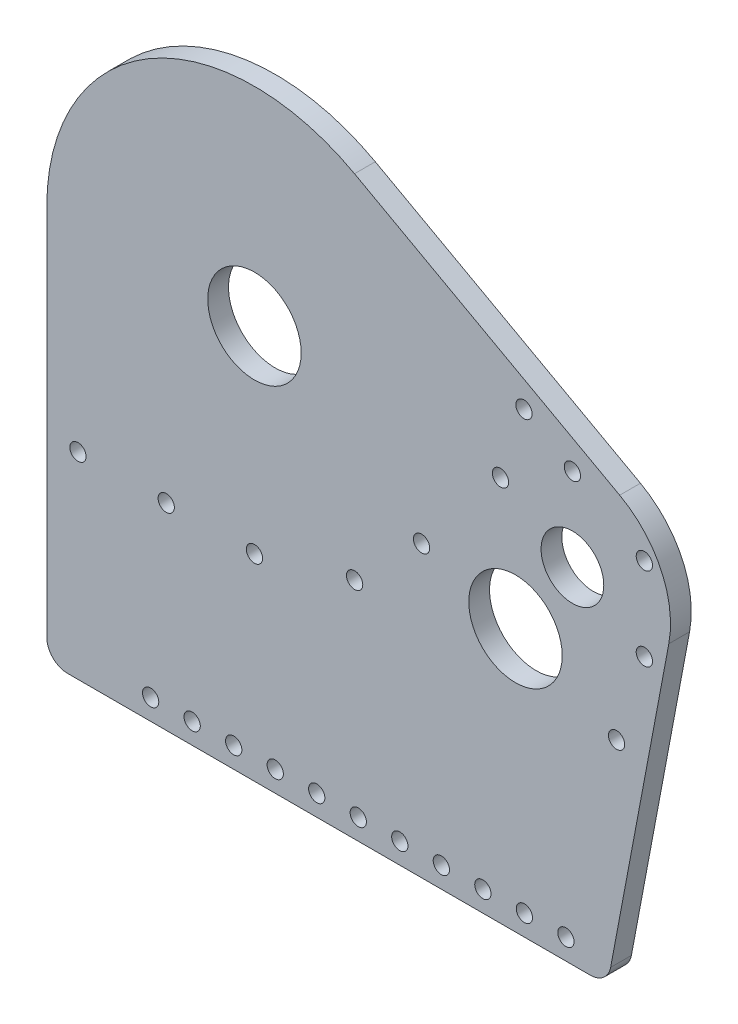
ISO-10303-21;
HEADER;
FILE_DESCRIPTION(('STEP AP214'),'2;1');
FILE_NAME('part.step','',(''),(''),'','','');
FILE_SCHEMA(('AUTOMOTIVE_DESIGN { 1 0 10303 214 1 1 1 1 }'));
ENDSEC;
DATA;
#1=APPLICATION_CONTEXT('core data for automotive mechanical design processes');
#2=APPLICATION_PROTOCOL_DEFINITION('international standard','automotive_design',2000,#1);
#3=PRODUCT_CONTEXT('',#1,'mechanical');
#4=PRODUCT('Part','Part','',(#3));
#5=PRODUCT_RELATED_PRODUCT_CATEGORY('part','',(#4));
#6=PRODUCT_DEFINITION_FORMATION('','',#4);
#7=PRODUCT_DEFINITION_CONTEXT('part definition',#1,'design');
#8=PRODUCT_DEFINITION('design','',#6,#7);
#9=PRODUCT_DEFINITION_SHAPE('','',#8);
#10=(LENGTH_UNIT() NAMED_UNIT(*) SI_UNIT(.MILLI.,.METRE.));
#11=(NAMED_UNIT(*) PLANE_ANGLE_UNIT() SI_UNIT($,.RADIAN.));
#12=(NAMED_UNIT(*) SI_UNIT($,.STERADIAN.) SOLID_ANGLE_UNIT());
#13=UNCERTAINTY_MEASURE_WITH_UNIT(LENGTH_MEASURE(1.E-05),#10,'distance_accuracy_value','');
#14=(GEOMETRIC_REPRESENTATION_CONTEXT(3) GLOBAL_UNCERTAINTY_ASSIGNED_CONTEXT((#13)) GLOBAL_UNIT_ASSIGNED_CONTEXT((#10,
#11,#12)) REPRESENTATION_CONTEXT('',''));
#15=CARTESIAN_POINT('',(0.,0.,0.));
#16=DIRECTION('',(0.,0.,1.));
#17=DIRECTION('',(1.,0.,0.));
#18=AXIS2_PLACEMENT_3D('',#15,#16,#17);
#19=CARTESIAN_POINT('',(88.9,154.686,-6.35));
#20=DIRECTION('',(-1.,0.,0.));
#21=DIRECTION('',(0.,-1.,0.));
#22=AXIS2_PLACEMENT_3D('',#19,#20,#21);
#23=PLANE('',#22);
#24=DIRECTION('',(0.,-1.,0.));
#25=VECTOR('',#24,1.);
#26=CARTESIAN_POINT('',(88.9,100.1522,-6.35));
#27=LINE('',#26,#25);
#28=CARTESIAN_POINT('',(88.8999999999999,220.726,-6.35));
#29=VERTEX_POINT('',#28);
#30=CARTESIAN_POINT('',(88.9,106.5022,-6.35));
#31=VERTEX_POINT('',#30);
#32=EDGE_CURVE('E167',#29,#31,#27,.T.);
#33=ORIENTED_EDGE('',*,*,#32,.T.);
#34=DIRECTION('',(0.,0.,1.));
#35=VECTOR('',#34,1.);
#36=CARTESIAN_POINT('',(88.9,106.5022,-6.35));
#37=LINE('',#36,#35);
#38=CARTESIAN_POINT('',(88.9,106.5022,0.));
#39=VERTEX_POINT('',#38);
#40=EDGE_CURVE('E11',#31,#39,#37,.T.);
#41=ORIENTED_EDGE('',*,*,#40,.T.);
#42=DIRECTION('',(0.,-1.,0.));
#43=VECTOR('',#42,1.);
#44=CARTESIAN_POINT('',(88.9,154.686,0.));
#45=LINE('',#44,#43);
#46=CARTESIAN_POINT('',(88.8999999999999,220.726,0.));
#47=VERTEX_POINT('',#46);
#48=EDGE_CURVE('E163',#47,#39,#45,.T.);
#49=ORIENTED_EDGE('',*,*,#48,.F.);
#50=DIRECTION('',(0.,0.,1.));
#51=VECTOR('',#50,1.);
#52=CARTESIAN_POINT('',(88.8999999999999,220.726,-6.35));
#53=LINE('',#52,#51);
#54=EDGE_CURVE('E168',#29,#47,#53,.T.);
#55=ORIENTED_EDGE('',*,*,#54,.F.);
#56=EDGE_LOOP('',(#33,#41,#49,#55));
#57=FACE_BOUND('',#56,.T.);
#58=ADVANCED_FACE('F45',(#57),#23,.T.);
#59=CARTESIAN_POINT('',(152.4,220.726,-6.35));
#60=DIRECTION('',(0.,0.,1.));
#61=DIRECTION('',(1.,0.,0.));
#62=AXIS2_PLACEMENT_3D('',#59,#60,#61);
#63=CYLINDRICAL_SURFACE('',#62,63.5);
#64=CARTESIAN_POINT('',(152.4,220.726,0.));
#65=DIRECTION('',(0.,0.,1.));
#66=DIRECTION('',(1.,0.,0.));
#67=AXIS2_PLACEMENT_3D('',#64,#65,#66);
#68=CIRCLE('',#67,63.5);
#69=CARTESIAN_POINT('',(182.999185553991,276.367170399556,0.));
#70=VERTEX_POINT('',#69);
#71=EDGE_CURVE('E159',#70,#47,#68,.T.);
#72=ORIENTED_EDGE('',*,*,#71,.F.);
#73=DIRECTION('',(0.,0.,1.));
#74=VECTOR('',#73,1.);
#75=CARTESIAN_POINT('',(182.999185553991,276.367170399556,-6.35));
#76=LINE('',#75,#74);
#77=CARTESIAN_POINT('',(182.999185553991,276.367170399556,-6.35));
#78=VERTEX_POINT('',#77);
#79=EDGE_CURVE('E172',#78,#70,#76,.T.);
#80=ORIENTED_EDGE('',*,*,#79,.F.);
#81=CARTESIAN_POINT('',(152.4,220.726,-6.35));
#82=DIRECTION('',(0.,0.,1.));
#83=DIRECTION('',(1.,0.,0.));
#84=AXIS2_PLACEMENT_3D('',#81,#82,#83);
#85=CIRCLE('',#84,63.5);
#86=EDGE_CURVE('E129',#78,#29,#85,.T.);
#87=ORIENTED_EDGE('',*,*,#86,.T.);
#88=ORIENTED_EDGE('',*,*,#54,.T.);
#89=EDGE_LOOP('',(#72,#80,#87,#88));
#90=FACE_BOUND('',#89,.T.);
#91=ADVANCED_FACE('F212',(#90),#63,.T.);
#92=CARTESIAN_POINT('',(182.999185553991,276.367170399556,-6.35));
#93=DIRECTION('',(0.481876937858131,0.876238903930013,0.));
#94=DIRECTION('',(-0.876238903930013,0.481876937858132,0.));
#95=AXIS2_PLACEMENT_3D('',#92,#93,#94);
#96=PLANE('',#95);
#97=DIRECTION('',(-0.876238903930013,0.481876937858131,0.));
#98=VECTOR('',#97,1.);
#99=CARTESIAN_POINT('',(182.999185553991,276.367170399556,0.));
#100=LINE('',#99,#98);
#101=CARTESIAN_POINT('',(264.092497462763,231.77088889675,0.));
#102=VERTEX_POINT('',#101);
#103=EDGE_CURVE('E155',#102,#70,#100,.T.);
#104=ORIENTED_EDGE('',*,*,#103,.F.);
#105=DIRECTION('',(0.,0.,1.));
#106=VECTOR('',#105,1.);
#107=CARTESIAN_POINT('',(264.092497462763,231.77088889675,-6.35));
#108=LINE('',#107,#106);
#109=CARTESIAN_POINT('',(264.092497462763,231.77088889675,-6.35));
#110=VERTEX_POINT('',#109);
#111=EDGE_CURVE('E128',#110,#102,#108,.T.);
#112=ORIENTED_EDGE('',*,*,#111,.F.);
#113=DIRECTION('',(-0.876238903930013,0.481876937858131,0.));
#114=VECTOR('',#113,1.);
#115=CARTESIAN_POINT('',(182.999185553991,276.367170399556,-6.35));
#116=LINE('',#115,#114);
#117=EDGE_CURVE('E135',#110,#78,#116,.T.);
#118=ORIENTED_EDGE('',*,*,#117,.T.);
#119=ORIENTED_EDGE('',*,*,#79,.T.);
#120=EDGE_LOOP('',(#104,#112,#118,#119));
#121=FACE_BOUND('',#120,.T.);
#122=ADVANCED_FACE('F214',(#121),#96,.T.);
#123=CARTESIAN_POINT('',(249.637442207057,205.486,-6.35));
#124=DIRECTION('',(0.,0.,1.));
#125=DIRECTION('',(1.,0.,0.));
#126=AXIS2_PLACEMENT_3D('',#123,#124,#125);
#127=CYLINDRICAL_SURFACE('',#126,29.9973999999996);
#128=CARTESIAN_POINT('',(249.637442207057,205.486,0.));
#129=DIRECTION('',(0.,0.,1.));
#130=DIRECTION('',(1.,0.,0.));
#131=AXIS2_PLACEMENT_3D('',#128,#129,#130);
#132=CIRCLE('',#131,29.9973999999996);
#133=CARTESIAN_POINT('',(279.11797123012,199.941415680115,0.));
#134=VERTEX_POINT('',#133);
#135=EDGE_CURVE('E126',#134,#102,#132,.T.);
#136=ORIENTED_EDGE('',*,*,#135,.F.);
#137=DIRECTION('',(0.,0.,1.));
#138=VECTOR('',#137,1.);
#139=CARTESIAN_POINT('',(279.11797123012,199.941415680115,-6.35));
#140=LINE('',#139,#138);
#141=CARTESIAN_POINT('',(279.11797123012,199.941415680115,-6.35));
#142=VERTEX_POINT('',#141);
#143=EDGE_CURVE('E114',#142,#134,#140,.T.);
#144=ORIENTED_EDGE('',*,*,#143,.F.);
#145=CARTESIAN_POINT('',(249.637442207057,205.486,-6.35));
#146=DIRECTION('',(0.,0.,1.));
#147=DIRECTION('',(1.,0.,0.));
#148=AXIS2_PLACEMENT_3D('',#145,#146,#147);
#149=CIRCLE('',#148,29.9973999999996);
#150=EDGE_CURVE('E119',#142,#110,#149,.T.);
#151=ORIENTED_EDGE('',*,*,#150,.T.);
#152=ORIENTED_EDGE('',*,*,#111,.T.);
#153=EDGE_LOOP('',(#136,#144,#151,#152));
#154=FACE_BOUND('',#153,.T.);
#155=ADVANCED_FACE('F124',(#154),#127,.T.);
#156=CARTESIAN_POINT('',(260.35,100.1522,-6.35));
#157=DIRECTION('',(0.982769474123205,-0.184835496405853,0.));
#158=DIRECTION('',(0.184835496405853,0.982769474123206,0.));
#159=AXIS2_PLACEMENT_3D('',#156,#157,#158);
#160=PLANE('',#159);
#161=DIRECTION('',(0.184835496405853,0.982769474123206,0.));
#162=VECTOR('',#161,1.);
#163=CARTESIAN_POINT('',(260.35,100.1522,0.));
#164=LINE('',#163,#162);
#165=CARTESIAN_POINT('',(261.3235375454,105.328494597823,0.));
#166=VERTEX_POINT('',#165);
#167=EDGE_CURVE('E149',#166,#134,#164,.T.);
#168=ORIENTED_EDGE('',*,*,#167,.F.);
#169=DIRECTION('',(0.,0.,1.));
#170=VECTOR('',#169,1.);
#171=CARTESIAN_POINT('',(261.3235375454,105.328494597823,-6.35));
#172=LINE('',#171,#170);
#173=CARTESIAN_POINT('',(261.3235375454,105.328494597823,-6.35));
#174=VERTEX_POINT('',#173);
#175=EDGE_CURVE('E69',#166,#174,#172,.F.);
#176=ORIENTED_EDGE('',*,*,#175,.T.);
#177=DIRECTION('',(0.184835496405853,0.982769474123206,0.));
#178=VECTOR('',#177,1.);
#179=CARTESIAN_POINT('',(260.35,100.1522,-6.35));
#180=LINE('',#179,#178);
#181=EDGE_CURVE('E111',#174,#142,#180,.T.);
#182=ORIENTED_EDGE('',*,*,#181,.T.);
#183=ORIENTED_EDGE('',*,*,#143,.T.);
#184=EDGE_LOOP('',(#168,#176,#182,#183));
#185=FACE_BOUND('',#184,.T.);
#186=ADVANCED_FACE('F113',(#185),#160,.T.);
#187=CARTESIAN_POINT('',(88.9,100.1522,-6.35));
#188=DIRECTION('',(0.,-1.,0.));
#189=DIRECTION('',(0.,0.,-1.));
#190=AXIS2_PLACEMENT_3D('',#187,#188,#189);
#191=PLANE('',#190);
#192=DIRECTION('',(1.,0.,0.));
#193=VECTOR('',#192,1.);
#194=CARTESIAN_POINT('',(88.9,100.1522,-6.35));
#195=LINE('',#194,#193);
#196=CARTESIAN_POINT('',(95.25,100.1522,-6.35));
#197=VERTEX_POINT('',#196);
#198=CARTESIAN_POINT('',(255.082951384717,100.1522,-6.35));
#199=VERTEX_POINT('',#198);
#200=EDGE_CURVE('E120',#197,#199,#195,.T.);
#201=ORIENTED_EDGE('',*,*,#200,.T.);
#202=DIRECTION('',(0.,0.,1.));
#203=VECTOR('',#202,1.);
#204=CARTESIAN_POINT('',(255.082951384717,100.1522,-6.35));
#205=LINE('',#204,#203);
#206=CARTESIAN_POINT('',(255.082951384717,100.1522,0.));
#207=VERTEX_POINT('',#206);
#208=EDGE_CURVE('E179',#199,#207,#205,.T.);
#209=ORIENTED_EDGE('',*,*,#208,.T.);
#210=DIRECTION('',(1.,0.,0.));
#211=VECTOR('',#210,1.);
#212=CARTESIAN_POINT('',(88.9,100.1522,0.));
#213=LINE('',#212,#211);
#214=CARTESIAN_POINT('',(95.25,100.1522,0.));
#215=VERTEX_POINT('',#214);
#216=EDGE_CURVE('E145',#215,#207,#213,.T.);
#217=ORIENTED_EDGE('',*,*,#216,.F.);
#218=DIRECTION('',(0.,0.,1.));
#219=VECTOR('',#218,1.);
#220=CARTESIAN_POINT('',(95.25,100.1522,-6.35));
#221=LINE('',#220,#219);
#222=EDGE_CURVE('E171',#215,#197,#221,.F.);
#223=ORIENTED_EDGE('',*,*,#222,.T.);
#224=EDGE_LOOP('',(#201,#209,#217,#223));
#225=FACE_BOUND('',#224,.T.);
#226=ADVANCED_FACE('F197',(#225),#191,.T.);
#227=CARTESIAN_POINT('',(152.4,220.726,-6.35));
#228=DIRECTION('',(0.,0.,1.));
#229=DIRECTION('',(1.,0.,0.));
#230=AXIS2_PLACEMENT_3D('',#227,#228,#229);
#231=PLANE('',#230);
#232=CARTESIAN_POINT('',(203.511307769551,188.683218549473,-6.35));
#233=DIRECTION('',(0.,0.,1.));
#234=DIRECTION('',(1.,0.,0.));
#235=AXIS2_PLACEMENT_3D('',#232,#233,#234);
#236=CIRCLE('',#235,2.48920000000001);
#237=CARTESIAN_POINT('',(206.000507769551,188.683218549473,-6.35));
#238=VERTEX_POINT('',#237);
#239=EDGE_CURVE('E442',#238,#238,#236,.T.);
#240=ORIENTED_EDGE('',*,*,#239,.T.);
#241=EDGE_LOOP('',(#240));
#242=FACE_BOUND('',#241,.T.);
#243=CARTESIAN_POINT('',(183.030900697863,168.756263157895,-6.35));
#244=DIRECTION('',(0.,0.,1.));
#245=DIRECTION('',(1.,0.,0.));
#246=AXIS2_PLACEMENT_3D('',#243,#244,#245);
#247=CIRCLE('',#246,2.48920000000001);
#248=CARTESIAN_POINT('',(185.520100697863,168.756263157895,-6.35));
#249=VERTEX_POINT('',#248);
#250=EDGE_CURVE('E450',#249,#249,#247,.T.);
#251=ORIENTED_EDGE('',*,*,#250,.T.);
#252=EDGE_LOOP('',(#251));
#253=FACE_BOUND('',#252,.T.);
#254=CARTESIAN_POINT('',(152.4,160.401,-6.35));
#255=DIRECTION('',(0.,0.,1.));
#256=DIRECTION('',(1.,0.,0.));
#257=AXIS2_PLACEMENT_3D('',#254,#255,#256);
#258=CIRCLE('',#257,2.48920000000001);
#259=CARTESIAN_POINT('',(154.8892,160.401,-6.35));
#260=VERTEX_POINT('',#259);
#261=EDGE_CURVE('E458',#260,#260,#258,.T.);
#262=ORIENTED_EDGE('',*,*,#261,.T.);
#263=EDGE_LOOP('',(#262));
#264=FACE_BOUND('',#263,.T.);
#265=CARTESIAN_POINT('',(247.65,106.5022,-6.35));
#266=DIRECTION('',(0.,0.,1.));
#267=DIRECTION('',(1.,0.,0.));
#268=AXIS2_PLACEMENT_3D('',#265,#266,#267);
#269=CIRCLE('',#268,2.48919999999998);
#270=CARTESIAN_POINT('',(250.1392,106.5022,-6.35));
#271=VERTEX_POINT('',#270);
#272=EDGE_CURVE('E413',#271,#271,#269,.T.);
#273=ORIENTED_EDGE('',*,*,#272,.T.);
#274=EDGE_LOOP('',(#273));
#275=FACE_BOUND('',#274,.T.);
#276=CARTESIAN_POINT('',(234.95,106.5022,-6.35));
#277=DIRECTION('',(0.,0.,1.));
#278=DIRECTION('',(1.,0.,0.));
#279=AXIS2_PLACEMENT_3D('',#276,#277,#278);
#280=CIRCLE('',#279,2.4892);
#281=CARTESIAN_POINT('',(237.4392,106.5022,-6.35));
#282=VERTEX_POINT('',#281);
#283=EDGE_CURVE('E414',#282,#282,#280,.T.);
#284=ORIENTED_EDGE('',*,*,#283,.T.);
#285=EDGE_LOOP('',(#284));
#286=FACE_BOUND('',#285,.T.);
#287=CARTESIAN_POINT('',(222.25,106.5022,-6.35));
#288=DIRECTION('',(0.,0.,1.));
#289=DIRECTION('',(1.,0.,0.));
#290=AXIS2_PLACEMENT_3D('',#287,#288,#289);
#291=CIRCLE('',#290,2.4892);
#292=CARTESIAN_POINT('',(224.7392,106.5022,-6.35));
#293=VERTEX_POINT('',#292);
#294=EDGE_CURVE('E422',#293,#293,#291,.T.);
#295=ORIENTED_EDGE('',*,*,#294,.T.);
#296=EDGE_LOOP('',(#295));
#297=FACE_BOUND('',#296,.T.);
#298=CARTESIAN_POINT('',(209.55,106.5022,-6.35));
#299=DIRECTION('',(0.,0.,1.));
#300=DIRECTION('',(1.,0.,0.));
#301=AXIS2_PLACEMENT_3D('',#298,#299,#300);
#302=CIRCLE('',#301,2.4892);
#303=CARTESIAN_POINT('',(212.0392,106.5022,-6.35));
#304=VERTEX_POINT('',#303);
#305=EDGE_CURVE('E430',#304,#304,#302,.T.);
#306=ORIENTED_EDGE('',*,*,#305,.T.);
#307=EDGE_LOOP('',(#306));
#308=FACE_BOUND('',#307,.T.);
#309=CARTESIAN_POINT('',(196.85,106.5022,-6.35));
#310=DIRECTION('',(0.,0.,1.));
#311=DIRECTION('',(1.,0.,0.));
#312=AXIS2_PLACEMENT_3D('',#309,#310,#311);
#313=CIRCLE('',#312,2.4892);
#314=CARTESIAN_POINT('',(199.3392,106.5022,-6.35));
#315=VERTEX_POINT('',#314);
#316=EDGE_CURVE('E344',#315,#315,#313,.T.);
#317=ORIENTED_EDGE('',*,*,#316,.T.);
#318=EDGE_LOOP('',(#317));
#319=FACE_BOUND('',#318,.T.);
#320=CARTESIAN_POINT('',(232.228248113131,180.467,-6.35));
#321=DIRECTION('',(0.,0.,1.));
#322=DIRECTION('',(1.,0.,0.));
#323=AXIS2_PLACEMENT_3D('',#320,#321,#322);
#324=CIRCLE('',#323,14.2875);
#325=CARTESIAN_POINT('',(246.515748113131,180.467,-6.35));
#326=VERTEX_POINT('',#325);
#327=EDGE_CURVE('E506',#326,#326,#324,.T.);
#328=ORIENTED_EDGE('',*,*,#327,.T.);
#329=EDGE_LOOP('',(#328));
#330=FACE_BOUND('',#329,.T.);
#331=CARTESIAN_POINT('',(152.4,220.726,-6.35));
#332=DIRECTION('',(0.,0.,1.));
#333=DIRECTION('',(1.,0.,0.));
#334=AXIS2_PLACEMENT_3D('',#331,#332,#333);
#335=CIRCLE('',#334,14.2875);
#336=CARTESIAN_POINT('',(166.6875,220.726,-6.35));
#337=VERTEX_POINT('',#336);
#338=EDGE_CURVE('E514',#337,#337,#335,.T.);
#339=ORIENTED_EDGE('',*,*,#338,.T.);
#340=EDGE_LOOP('',(#339));
#341=FACE_BOUND('',#340,.T.);
#342=CARTESIAN_POINT('',(263.132585571943,166.479503995345,-6.35));
#343=DIRECTION('',(0.,0.,1.));
#344=DIRECTION('',(1.,0.,0.));
#345=AXIS2_PLACEMENT_3D('',#342,#343,#344);
#346=CIRCLE('',#345,2.48920000000001);
#347=CARTESIAN_POINT('',(265.621785571943,166.479503995345,-6.35));
#348=VERTEX_POINT('',#347);
#349=EDGE_CURVE('E522',#348,#348,#346,.T.);
#350=ORIENTED_EDGE('',*,*,#349,.T.);
#351=EDGE_LOOP('',(#350));
#352=FACE_BOUND('',#351,.T.);
#353=CARTESIAN_POINT('',(271.634487463182,192.786,-6.35));
#354=DIRECTION('',(0.,0.,1.));
#355=DIRECTION('',(1.,0.,0.));
#356=AXIS2_PLACEMENT_3D('',#353,#354,#355);
#357=CIRCLE('',#356,2.48920000000001);
#358=CARTESIAN_POINT('',(274.123687463182,192.786,-6.35));
#359=VERTEX_POINT('',#358);
#360=EDGE_CURVE('E473',#359,#359,#357,.T.);
#361=ORIENTED_EDGE('',*,*,#360,.T.);
#362=EDGE_LOOP('',(#361));
#363=FACE_BOUND('',#362,.T.);
#364=CARTESIAN_POINT('',(271.634487463182,218.186,-6.35));
#365=DIRECTION('',(0.,0.,1.));
#366=DIRECTION('',(1.,0.,0.));
#367=AXIS2_PLACEMENT_3D('',#364,#365,#366);
#368=CIRCLE('',#367,2.48920000000001);
#369=CARTESIAN_POINT('',(274.123687463182,218.186,-6.35));
#370=VERTEX_POINT('',#369);
#371=EDGE_CURVE('E474',#370,#370,#368,.T.);
#372=ORIENTED_EDGE('',*,*,#371,.T.);
#373=EDGE_LOOP('',(#372));
#374=FACE_BOUND('',#373,.T.);
#375=CARTESIAN_POINT('',(249.637442207057,230.886,-6.35));
#376=DIRECTION('',(0.,0.,1.));
#377=DIRECTION('',(1.,0.,0.));
#378=AXIS2_PLACEMENT_3D('',#375,#376,#377);
#379=CIRCLE('',#378,2.48920000000001);
#380=CARTESIAN_POINT('',(252.126642207057,230.886,-6.35));
#381=VERTEX_POINT('',#380);
#382=EDGE_CURVE('E482',#381,#381,#379,.T.);
#383=ORIENTED_EDGE('',*,*,#382,.T.);
#384=EDGE_LOOP('',(#383));
#385=FACE_BOUND('',#384,.T.);
#386=CARTESIAN_POINT('',(234.821081090213,239.896778373284,-6.35));
#387=DIRECTION('',(0.,0.,1.));
#388=DIRECTION('',(1.,0.,0.));
#389=AXIS2_PLACEMENT_3D('',#386,#387,#388);
#390=CIRCLE('',#389,2.48920000000001);
#391=CARTESIAN_POINT('',(237.310281090213,239.896778373284,-6.35));
#392=VERTEX_POINT('',#391);
#393=EDGE_CURVE('E490',#392,#392,#390,.T.);
#394=ORIENTED_EDGE('',*,*,#393,.T.);
#395=EDGE_LOOP('',(#394));
#396=FACE_BOUND('',#395,.T.);
#397=CARTESIAN_POINT('',(227.640396950932,218.186,-6.35));
#398=DIRECTION('',(0.,0.,1.));
#399=DIRECTION('',(1.,0.,0.));
#400=AXIS2_PLACEMENT_3D('',#397,#398,#399);
#401=CIRCLE('',#400,2.48920000000003);
#402=CARTESIAN_POINT('',(230.129596950932,218.186,-6.35));
#403=VERTEX_POINT('',#402);
#404=EDGE_CURVE('E441',#403,#403,#401,.T.);
#405=ORIENTED_EDGE('',*,*,#404,.T.);
#406=EDGE_LOOP('',(#405));
#407=FACE_BOUND('',#406,.T.);
#408=CARTESIAN_POINT('',(184.15,106.5022,-6.35));
#409=DIRECTION('',(0.,0.,1.));
#410=DIRECTION('',(1.,0.,0.));
#411=AXIS2_PLACEMENT_3D('',#408,#409,#410);
#412=CIRCLE('',#411,2.4892);
#413=CARTESIAN_POINT('',(186.6392,106.5022,-6.35));
#414=VERTEX_POINT('',#413);
#415=EDGE_CURVE('E338',#414,#414,#412,.T.);
#416=ORIENTED_EDGE('',*,*,#415,.T.);
#417=EDGE_LOOP('',(#416));
#418=FACE_BOUND('',#417,.T.);
#419=CARTESIAN_POINT('',(171.45,106.5022,-6.35));
#420=DIRECTION('',(0.,0.,1.));
#421=DIRECTION('',(1.,0.,0.));
#422=AXIS2_PLACEMENT_3D('',#419,#420,#421);
#423=CIRCLE('',#422,2.4892);
#424=CARTESIAN_POINT('',(173.9392,106.5022,-6.35));
#425=VERTEX_POINT('',#424);
#426=EDGE_CURVE('E357',#425,#425,#423,.T.);
#427=ORIENTED_EDGE('',*,*,#426,.T.);
#428=EDGE_LOOP('',(#427));
#429=FACE_BOUND('',#428,.T.);
#430=CARTESIAN_POINT('',(158.75,106.5022,-6.35));
#431=DIRECTION('',(0.,0.,1.));
#432=DIRECTION('',(1.,0.,0.));
#433=AXIS2_PLACEMENT_3D('',#430,#431,#432);
#434=CIRCLE('',#433,2.4892);
#435=CARTESIAN_POINT('',(161.2392,106.5022,-6.35));
#436=VERTEX_POINT('',#435);
#437=EDGE_CURVE('E365',#436,#436,#434,.T.);
#438=ORIENTED_EDGE('',*,*,#437,.T.);
#439=EDGE_LOOP('',(#438));
#440=FACE_BOUND('',#439,.T.);
#441=CARTESIAN_POINT('',(146.05,106.5022,-6.35));
#442=DIRECTION('',(0.,0.,1.));
#443=DIRECTION('',(1.,0.,0.));
#444=AXIS2_PLACEMENT_3D('',#441,#442,#443);
#445=CIRCLE('',#444,2.4892);
#446=CARTESIAN_POINT('',(148.5392,106.5022,-6.35));
#447=VERTEX_POINT('',#446);
#448=EDGE_CURVE('E373',#447,#447,#445,.T.);
#449=ORIENTED_EDGE('',*,*,#448,.T.);
#450=EDGE_LOOP('',(#449));
#451=FACE_BOUND('',#450,.T.);
#452=CARTESIAN_POINT('',(133.35,106.5022,-6.35));
#453=DIRECTION('',(0.,0.,1.));
#454=DIRECTION('',(1.,0.,0.));
#455=AXIS2_PLACEMENT_3D('',#452,#453,#454);
#456=CIRCLE('',#455,2.4892);
#457=CARTESIAN_POINT('',(135.8392,106.5022,-6.35));
#458=VERTEX_POINT('',#457);
#459=EDGE_CURVE('E381',#458,#458,#456,.T.);
#460=ORIENTED_EDGE('',*,*,#459,.T.);
#461=EDGE_LOOP('',(#460));
#462=FACE_BOUND('',#461,.T.);
#463=CARTESIAN_POINT('',(120.65,106.5022,-6.35));
#464=DIRECTION('',(0.,0.,1.));
#465=DIRECTION('',(1.,0.,0.));
#466=AXIS2_PLACEMENT_3D('',#463,#464,#465);
#467=CIRCLE('',#466,2.4892);
#468=CARTESIAN_POINT('',(123.1392,106.5022,-6.35));
#469=VERTEX_POINT('',#468);
#470=EDGE_CURVE('E389',#469,#469,#467,.T.);
#471=ORIENTED_EDGE('',*,*,#470,.T.);
#472=EDGE_LOOP('',(#471));
#473=FACE_BOUND('',#472,.T.);
#474=CARTESIAN_POINT('',(98.425,160.401,-6.35));
#475=DIRECTION('',(0.,0.,1.));
#476=DIRECTION('',(1.,0.,0.));
#477=AXIS2_PLACEMENT_3D('',#474,#475,#476);
#478=CIRCLE('',#477,2.48920000000002);
#479=CARTESIAN_POINT('',(100.9142,160.401,-6.35));
#480=VERTEX_POINT('',#479);
#481=EDGE_CURVE('E397',#480,#480,#478,.T.);
#482=ORIENTED_EDGE('',*,*,#481,.T.);
#483=EDGE_LOOP('',(#482));
#484=FACE_BOUND('',#483,.T.);
#485=CARTESIAN_POINT('',(125.4125,160.401,-6.35));
#486=DIRECTION('',(0.,0.,1.));
#487=DIRECTION('',(1.,0.,0.));
#488=AXIS2_PLACEMENT_3D('',#485,#486,#487);
#489=CIRCLE('',#488,2.48920000000001);
#490=CARTESIAN_POINT('',(127.9017,160.401,-6.35));
#491=VERTEX_POINT('',#490);
#492=EDGE_CURVE('E405',#491,#491,#489,.T.);
#493=ORIENTED_EDGE('',*,*,#492,.T.);
#494=EDGE_LOOP('',(#493));
#495=FACE_BOUND('',#494,.T.);
#496=CARTESIAN_POINT('',(249.637442207057,205.486,-6.35));
#497=DIRECTION('',(0.,0.,1.));
#498=DIRECTION('',(1.,0.,0.));
#499=AXIS2_PLACEMENT_3D('',#496,#497,#498);
#500=CIRCLE('',#499,9.5885);
#501=CARTESIAN_POINT('',(259.225942207057,205.486,-6.35));
#502=VERTEX_POINT('',#501);
#503=EDGE_CURVE('E150',#502,#502,#500,.T.);
#504=ORIENTED_EDGE('',*,*,#503,.T.);
#505=EDGE_LOOP('',(#504));
#506=FACE_BOUND('',#505,.T.);
#507=ORIENTED_EDGE('',*,*,#181,.F.);
#508=CARTESIAN_POINT('',(255.082951384717,106.5022,-6.35));
#509=DIRECTION('',(0.,0.,1.));
#510=DIRECTION('',(1.,0.,0.));
#511=AXIS2_PLACEMENT_3D('',#508,#509,#510);
#512=CIRCLE('',#511,6.35);
#513=EDGE_CURVE('E54',#174,#199,#512,.F.);
#514=ORIENTED_EDGE('',*,*,#513,.T.);
#515=ORIENTED_EDGE('',*,*,#200,.F.);
#516=CARTESIAN_POINT('',(95.25,106.5022,-6.35));
#517=DIRECTION('',(0.,0.,1.));
#518=DIRECTION('',(1.,0.,0.));
#519=AXIS2_PLACEMENT_3D('',#516,#517,#518);
#520=CIRCLE('',#519,6.35);
#521=EDGE_CURVE('E61',#197,#31,#520,.F.);
#522=ORIENTED_EDGE('',*,*,#521,.T.);
#523=ORIENTED_EDGE('',*,*,#32,.F.);
#524=ORIENTED_EDGE('',*,*,#86,.F.);
#525=ORIENTED_EDGE('',*,*,#117,.F.);
#526=ORIENTED_EDGE('',*,*,#150,.F.);
#527=EDGE_LOOP('',(#507,#514,#515,#522,#523,#524,#525,#526));
#528=FACE_BOUND('',#527,.T.);
#529=ADVANCED_FACE('F132',(#242,#253,#264,#275,#286,#297,#308,#319,#330,#341,#352,#363,#374,
#385,#396,#407,#418,#429,#440,#451,#462,#473,#484,#495,#506,#528),#231,.F.);
#530=CARTESIAN_POINT('',(152.4,220.726,0.));
#531=DIRECTION('',(0.,0.,1.));
#532=DIRECTION('',(1.,0.,0.));
#533=AXIS2_PLACEMENT_3D('',#530,#531,#532);
#534=PLANE('',#533);
#535=CARTESIAN_POINT('',(203.511307769551,188.683218549473,0.));
#536=DIRECTION('',(0.,0.,1.));
#537=DIRECTION('',(1.,0.,0.));
#538=AXIS2_PLACEMENT_3D('',#535,#536,#537);
#539=CIRCLE('',#538,2.48920000000001);
#540=CARTESIAN_POINT('',(206.000507769551,188.683218549473,0.));
#541=VERTEX_POINT('',#540);
#542=EDGE_CURVE('E437',#541,#541,#539,.T.);
#543=ORIENTED_EDGE('',*,*,#542,.F.);
#544=EDGE_LOOP('',(#543));
#545=FACE_BOUND('',#544,.T.);
#546=CARTESIAN_POINT('',(183.030900697863,168.756263157895,0.));
#547=DIRECTION('',(0.,0.,1.));
#548=DIRECTION('',(1.,0.,0.));
#549=AXIS2_PLACEMENT_3D('',#546,#547,#548);
#550=CIRCLE('',#549,2.48920000000001);
#551=CARTESIAN_POINT('',(185.520100697863,168.756263157895,0.));
#552=VERTEX_POINT('',#551);
#553=EDGE_CURVE('E446',#552,#552,#550,.T.);
#554=ORIENTED_EDGE('',*,*,#553,.F.);
#555=EDGE_LOOP('',(#554));
#556=FACE_BOUND('',#555,.T.);
#557=CARTESIAN_POINT('',(152.4,160.401,0.));
#558=DIRECTION('',(0.,0.,1.));
#559=DIRECTION('',(1.,0.,0.));
#560=AXIS2_PLACEMENT_3D('',#557,#558,#559);
#561=CIRCLE('',#560,2.48920000000001);
#562=CARTESIAN_POINT('',(154.8892,160.401,0.));
#563=VERTEX_POINT('',#562);
#564=EDGE_CURVE('E454',#563,#563,#561,.T.);
#565=ORIENTED_EDGE('',*,*,#564,.F.);
#566=EDGE_LOOP('',(#565));
#567=FACE_BOUND('',#566,.T.);
#568=CARTESIAN_POINT('',(247.65,106.5022,0.));
#569=DIRECTION('',(0.,0.,1.));
#570=DIRECTION('',(1.,0.,0.));
#571=AXIS2_PLACEMENT_3D('',#568,#569,#570);
#572=CIRCLE('',#571,2.48919999999998);
#573=CARTESIAN_POINT('',(250.1392,106.5022,0.));
#574=VERTEX_POINT('',#573);
#575=EDGE_CURVE('E462',#574,#574,#572,.T.);
#576=ORIENTED_EDGE('',*,*,#575,.F.);
#577=EDGE_LOOP('',(#576));
#578=FACE_BOUND('',#577,.T.);
#579=CARTESIAN_POINT('',(234.95,106.5022,0.));
#580=DIRECTION('',(0.,0.,1.));
#581=DIRECTION('',(1.,0.,0.));
#582=AXIS2_PLACEMENT_3D('',#579,#580,#581);
#583=CIRCLE('',#582,2.4892);
#584=CARTESIAN_POINT('',(237.4392,106.5022,0.));
#585=VERTEX_POINT('',#584);
#586=EDGE_CURVE('E409',#585,#585,#583,.T.);
#587=ORIENTED_EDGE('',*,*,#586,.F.);
#588=EDGE_LOOP('',(#587));
#589=FACE_BOUND('',#588,.T.);
#590=CARTESIAN_POINT('',(222.25,106.5022,0.));
#591=DIRECTION('',(0.,0.,1.));
#592=DIRECTION('',(1.,0.,0.));
#593=AXIS2_PLACEMENT_3D('',#590,#591,#592);
#594=CIRCLE('',#593,2.4892);
#595=CARTESIAN_POINT('',(224.7392,106.5022,0.));
#596=VERTEX_POINT('',#595);
#597=EDGE_CURVE('E418',#596,#596,#594,.T.);
#598=ORIENTED_EDGE('',*,*,#597,.F.);
#599=EDGE_LOOP('',(#598));
#600=FACE_BOUND('',#599,.T.);
#601=CARTESIAN_POINT('',(209.55,106.5022,0.));
#602=DIRECTION('',(0.,0.,1.));
#603=DIRECTION('',(1.,0.,0.));
#604=AXIS2_PLACEMENT_3D('',#601,#602,#603);
#605=CIRCLE('',#604,2.4892);
#606=CARTESIAN_POINT('',(212.0392,106.5022,0.));
#607=VERTEX_POINT('',#606);
#608=EDGE_CURVE('E426',#607,#607,#605,.T.);
#609=ORIENTED_EDGE('',*,*,#608,.F.);
#610=EDGE_LOOP('',(#609));
#611=FACE_BOUND('',#610,.T.);
#612=CARTESIAN_POINT('',(196.85,106.5022,0.));
#613=DIRECTION('',(0.,0.,1.));
#614=DIRECTION('',(1.,0.,0.));
#615=AXIS2_PLACEMENT_3D('',#612,#613,#614);
#616=CIRCLE('',#615,2.4892);
#617=CARTESIAN_POINT('',(199.3392,106.5022,0.));
#618=VERTEX_POINT('',#617);
#619=EDGE_CURVE('E349',#618,#618,#616,.T.);
#620=ORIENTED_EDGE('',*,*,#619,.F.);
#621=EDGE_LOOP('',(#620));
#622=FACE_BOUND('',#621,.T.);
#623=CARTESIAN_POINT('',(232.228248113131,180.467,0.));
#624=DIRECTION('',(0.,0.,1.));
#625=DIRECTION('',(1.,0.,0.));
#626=AXIS2_PLACEMENT_3D('',#623,#624,#625);
#627=CIRCLE('',#626,14.2875);
#628=CARTESIAN_POINT('',(246.515748113131,180.467,0.));
#629=VERTEX_POINT('',#628);
#630=EDGE_CURVE('E501',#629,#629,#627,.T.);
#631=ORIENTED_EDGE('',*,*,#630,.F.);
#632=EDGE_LOOP('',(#631));
#633=FACE_BOUND('',#632,.T.);
#634=CARTESIAN_POINT('',(152.4,220.726,0.));
#635=DIRECTION('',(0.,0.,1.));
#636=DIRECTION('',(1.,0.,0.));
#637=AXIS2_PLACEMENT_3D('',#634,#635,#636);
#638=CIRCLE('',#637,14.2875);
#639=CARTESIAN_POINT('',(166.6875,220.726,0.));
#640=VERTEX_POINT('',#639);
#641=EDGE_CURVE('E510',#640,#640,#638,.T.);
#642=ORIENTED_EDGE('',*,*,#641,.F.);
#643=EDGE_LOOP('',(#642));
#644=FACE_BOUND('',#643,.T.);
#645=CARTESIAN_POINT('',(263.132585571943,166.479503995345,0.));
#646=DIRECTION('',(0.,0.,1.));
#647=DIRECTION('',(1.,0.,0.));
#648=AXIS2_PLACEMENT_3D('',#645,#646,#647);
#649=CIRCLE('',#648,2.48920000000001);
#650=CARTESIAN_POINT('',(265.621785571943,166.479503995345,0.));
#651=VERTEX_POINT('',#650);
#652=EDGE_CURVE('E518',#651,#651,#649,.T.);
#653=ORIENTED_EDGE('',*,*,#652,.F.);
#654=EDGE_LOOP('',(#653));
#655=FACE_BOUND('',#654,.T.);
#656=CARTESIAN_POINT('',(271.634487463182,192.786,0.));
#657=DIRECTION('',(0.,0.,1.));
#658=DIRECTION('',(1.,0.,0.));
#659=AXIS2_PLACEMENT_3D('',#656,#657,#658);
#660=CIRCLE('',#659,2.48920000000001);
#661=CARTESIAN_POINT('',(274.123687463182,192.786,0.));
#662=VERTEX_POINT('',#661);
#663=EDGE_CURVE('E526',#662,#662,#660,.T.);
#664=ORIENTED_EDGE('',*,*,#663,.F.);
#665=EDGE_LOOP('',(#664));
#666=FACE_BOUND('',#665,.T.);
#667=CARTESIAN_POINT('',(271.634487463182,218.186,0.));
#668=DIRECTION('',(0.,0.,1.));
#669=DIRECTION('',(1.,0.,0.));
#670=AXIS2_PLACEMENT_3D('',#667,#668,#669);
#671=CIRCLE('',#670,2.48920000000001);
#672=CARTESIAN_POINT('',(274.123687463182,218.186,0.));
#673=VERTEX_POINT('',#672);
#674=EDGE_CURVE('E469',#673,#673,#671,.T.);
#675=ORIENTED_EDGE('',*,*,#674,.F.);
#676=EDGE_LOOP('',(#675));
#677=FACE_BOUND('',#676,.T.);
#678=CARTESIAN_POINT('',(249.637442207057,230.886,0.));
#679=DIRECTION('',(0.,0.,1.));
#680=DIRECTION('',(1.,0.,0.));
#681=AXIS2_PLACEMENT_3D('',#678,#679,#680);
#682=CIRCLE('',#681,2.48920000000001);
#683=CARTESIAN_POINT('',(252.126642207057,230.886,0.));
#684=VERTEX_POINT('',#683);
#685=EDGE_CURVE('E478',#684,#684,#682,.T.);
#686=ORIENTED_EDGE('',*,*,#685,.F.);
#687=EDGE_LOOP('',(#686));
#688=FACE_BOUND('',#687,.T.);
#689=CARTESIAN_POINT('',(234.821081090213,239.896778373284,0.));
#690=DIRECTION('',(0.,0.,1.));
#691=DIRECTION('',(1.,0.,0.));
#692=AXIS2_PLACEMENT_3D('',#689,#690,#691);
#693=CIRCLE('',#692,2.48920000000001);
#694=CARTESIAN_POINT('',(237.310281090213,239.896778373284,0.));
#695=VERTEX_POINT('',#694);
#696=EDGE_CURVE('E486',#695,#695,#693,.T.);
#697=ORIENTED_EDGE('',*,*,#696,.F.);
#698=EDGE_LOOP('',(#697));
#699=FACE_BOUND('',#698,.T.);
#700=CARTESIAN_POINT('',(227.640396950932,218.186,0.));
#701=DIRECTION('',(0.,0.,1.));
#702=DIRECTION('',(1.,0.,0.));
#703=AXIS2_PLACEMENT_3D('',#700,#701,#702);
#704=CIRCLE('',#703,2.48920000000003);
#705=CARTESIAN_POINT('',(230.129596950932,218.186,0.));
#706=VERTEX_POINT('',#705);
#707=EDGE_CURVE('E494',#706,#706,#704,.T.);
#708=ORIENTED_EDGE('',*,*,#707,.F.);
#709=EDGE_LOOP('',(#708));
#710=FACE_BOUND('',#709,.T.);
#711=CARTESIAN_POINT('',(184.15,106.5022,0.));
#712=DIRECTION('',(0.,0.,1.));
#713=DIRECTION('',(1.,0.,0.));
#714=AXIS2_PLACEMENT_3D('',#711,#712,#713);
#715=CIRCLE('',#714,2.4892);
#716=CARTESIAN_POINT('',(186.6392,106.5022,0.));
#717=VERTEX_POINT('',#716);
#718=EDGE_CURVE('E341',#717,#717,#715,.T.);
#719=ORIENTED_EDGE('',*,*,#718,.F.);
#720=EDGE_LOOP('',(#719));
#721=FACE_BOUND('',#720,.T.);
#722=CARTESIAN_POINT('',(171.45,106.5022,0.));
#723=DIRECTION('',(0.,0.,1.));
#724=DIRECTION('',(1.,0.,0.));
#725=AXIS2_PLACEMENT_3D('',#722,#723,#724);
#726=CIRCLE('',#725,2.4892);
#727=CARTESIAN_POINT('',(173.9392,106.5022,0.));
#728=VERTEX_POINT('',#727);
#729=EDGE_CURVE('E351',#728,#728,#726,.T.);
#730=ORIENTED_EDGE('',*,*,#729,.F.);
#731=EDGE_LOOP('',(#730));
#732=FACE_BOUND('',#731,.T.);
#733=CARTESIAN_POINT('',(158.75,106.5022,0.));
#734=DIRECTION('',(0.,0.,1.));
#735=DIRECTION('',(1.,0.,0.));
#736=AXIS2_PLACEMENT_3D('',#733,#734,#735);
#737=CIRCLE('',#736,2.4892);
#738=CARTESIAN_POINT('',(161.2392,106.5022,0.));
#739=VERTEX_POINT('',#738);
#740=EDGE_CURVE('E361',#739,#739,#737,.T.);
#741=ORIENTED_EDGE('',*,*,#740,.F.);
#742=EDGE_LOOP('',(#741));
#743=FACE_BOUND('',#742,.T.);
#744=CARTESIAN_POINT('',(146.05,106.5022,0.));
#745=DIRECTION('',(0.,0.,1.));
#746=DIRECTION('',(1.,0.,0.));
#747=AXIS2_PLACEMENT_3D('',#744,#745,#746);
#748=CIRCLE('',#747,2.4892);
#749=CARTESIAN_POINT('',(148.5392,106.5022,0.));
#750=VERTEX_POINT('',#749);
#751=EDGE_CURVE('E369',#750,#750,#748,.T.);
#752=ORIENTED_EDGE('',*,*,#751,.F.);
#753=EDGE_LOOP('',(#752));
#754=FACE_BOUND('',#753,.T.);
#755=CARTESIAN_POINT('',(133.35,106.5022,0.));
#756=DIRECTION('',(0.,0.,1.));
#757=DIRECTION('',(1.,0.,0.));
#758=AXIS2_PLACEMENT_3D('',#755,#756,#757);
#759=CIRCLE('',#758,2.4892);
#760=CARTESIAN_POINT('',(135.8392,106.5022,0.));
#761=VERTEX_POINT('',#760);
#762=EDGE_CURVE('E377',#761,#761,#759,.T.);
#763=ORIENTED_EDGE('',*,*,#762,.F.);
#764=EDGE_LOOP('',(#763));
#765=FACE_BOUND('',#764,.T.);
#766=CARTESIAN_POINT('',(120.65,106.5022,0.));
#767=DIRECTION('',(0.,0.,1.));
#768=DIRECTION('',(1.,0.,0.));
#769=AXIS2_PLACEMENT_3D('',#766,#767,#768);
#770=CIRCLE('',#769,2.4892);
#771=CARTESIAN_POINT('',(123.1392,106.5022,0.));
#772=VERTEX_POINT('',#771);
#773=EDGE_CURVE('E385',#772,#772,#770,.T.);
#774=ORIENTED_EDGE('',*,*,#773,.F.);
#775=EDGE_LOOP('',(#774));
#776=FACE_BOUND('',#775,.T.);
#777=CARTESIAN_POINT('',(98.425,160.401,0.));
#778=DIRECTION('',(0.,0.,1.));
#779=DIRECTION('',(1.,0.,0.));
#780=AXIS2_PLACEMENT_3D('',#777,#778,#779);
#781=CIRCLE('',#780,2.48920000000002);
#782=CARTESIAN_POINT('',(100.9142,160.401,0.));
#783=VERTEX_POINT('',#782);
#784=EDGE_CURVE('E393',#783,#783,#781,.T.);
#785=ORIENTED_EDGE('',*,*,#784,.F.);
#786=EDGE_LOOP('',(#785));
#787=FACE_BOUND('',#786,.T.);
#788=CARTESIAN_POINT('',(125.4125,160.401,0.));
#789=DIRECTION('',(0.,0.,1.));
#790=DIRECTION('',(1.,0.,0.));
#791=AXIS2_PLACEMENT_3D('',#788,#789,#790);
#792=CIRCLE('',#791,2.48920000000001);
#793=CARTESIAN_POINT('',(127.9017,160.401,0.));
#794=VERTEX_POINT('',#793);
#795=EDGE_CURVE('E401',#794,#794,#792,.T.);
#796=ORIENTED_EDGE('',*,*,#795,.F.);
#797=EDGE_LOOP('',(#796));
#798=FACE_BOUND('',#797,.T.);
#799=CARTESIAN_POINT('',(249.637442207057,205.486,0.));
#800=DIRECTION('',(0.,0.,1.));
#801=DIRECTION('',(1.,0.,0.));
#802=AXIS2_PLACEMENT_3D('',#799,#800,#801);
#803=CIRCLE('',#802,9.5885);
#804=CARTESIAN_POINT('',(259.225942207057,205.486,0.));
#805=VERTEX_POINT('',#804);
#806=EDGE_CURVE('E505',#805,#805,#803,.T.);
#807=ORIENTED_EDGE('',*,*,#806,.F.);
#808=EDGE_LOOP('',(#807));
#809=FACE_BOUND('',#808,.T.);
#810=ORIENTED_EDGE('',*,*,#216,.T.);
#811=CARTESIAN_POINT('',(255.082951384717,106.5022,0.));
#812=DIRECTION('',(0.,0.,1.));
#813=DIRECTION('',(1.,0.,0.));
#814=AXIS2_PLACEMENT_3D('',#811,#812,#813);
#815=CIRCLE('',#814,6.35);
#816=EDGE_CURVE('E186',#207,#166,#815,.T.);
#817=ORIENTED_EDGE('',*,*,#816,.T.);
#818=ORIENTED_EDGE('',*,*,#167,.T.);
#819=ORIENTED_EDGE('',*,*,#135,.T.);
#820=ORIENTED_EDGE('',*,*,#103,.T.);
#821=ORIENTED_EDGE('',*,*,#71,.T.);
#822=ORIENTED_EDGE('',*,*,#48,.T.);
#823=CARTESIAN_POINT('',(95.25,106.5022,0.));
#824=DIRECTION('',(0.,0.,1.));
#825=DIRECTION('',(1.,0.,0.));
#826=AXIS2_PLACEMENT_3D('',#823,#824,#825);
#827=CIRCLE('',#826,6.35);
#828=EDGE_CURVE('E183',#39,#215,#827,.T.);
#829=ORIENTED_EDGE('',*,*,#828,.T.);
#830=EDGE_LOOP('',(#810,#817,#818,#819,#820,#821,#822,#829));
#831=FACE_BOUND('',#830,.T.);
#832=ADVANCED_FACE('F203',(#545,#556,#567,#578,#589,#600,#611,#622,#633,#644,#655,#666,#677,
#688,#699,#710,#721,#732,#743,#754,#765,#776,#787,#798,#809,#831),#534,.T.);
#833=CARTESIAN_POINT('',(249.637442207057,205.486,-6.35));
#834=DIRECTION('',(0.,0.,1.));
#835=DIRECTION('',(1.,0.,0.));
#836=AXIS2_PLACEMENT_3D('',#833,#834,#835);
#837=CYLINDRICAL_SURFACE('',#836,9.5885);
#838=ORIENTED_EDGE('',*,*,#503,.F.);
#839=EDGE_LOOP('',(#838));
#840=FACE_BOUND('',#839,.T.);
#841=ORIENTED_EDGE('',*,*,#806,.T.);
#842=EDGE_LOOP('',(#841));
#843=FACE_BOUND('',#842,.T.);
#844=ADVANCED_FACE('F230',(#840,#843),#837,.F.);
#845=CARTESIAN_POINT('',(125.4125,160.401,-6.35));
#846=DIRECTION('',(0.,0.,1.));
#847=DIRECTION('',(1.,0.,0.));
#848=AXIS2_PLACEMENT_3D('',#845,#846,#847);
#849=CYLINDRICAL_SURFACE('',#848,2.48920000000001);
#850=ORIENTED_EDGE('',*,*,#492,.F.);
#851=EDGE_LOOP('',(#850));
#852=FACE_BOUND('',#851,.T.);
#853=ORIENTED_EDGE('',*,*,#795,.T.);
#854=EDGE_LOOP('',(#853));
#855=FACE_BOUND('',#854,.T.);
#856=ADVANCED_FACE('F237',(#852,#855),#849,.F.);
#857=CARTESIAN_POINT('',(98.425,160.401,-6.35));
#858=DIRECTION('',(0.,0.,1.));
#859=DIRECTION('',(1.,0.,0.));
#860=AXIS2_PLACEMENT_3D('',#857,#858,#859);
#861=CYLINDRICAL_SURFACE('',#860,2.48920000000002);
#862=ORIENTED_EDGE('',*,*,#481,.F.);
#863=EDGE_LOOP('',(#862));
#864=FACE_BOUND('',#863,.T.);
#865=ORIENTED_EDGE('',*,*,#784,.T.);
#866=EDGE_LOOP('',(#865));
#867=FACE_BOUND('',#866,.T.);
#868=ADVANCED_FACE('F306',(#864,#867),#861,.F.);
#869=CARTESIAN_POINT('',(120.65,106.5022,-6.35));
#870=DIRECTION('',(0.,0.,1.));
#871=DIRECTION('',(1.,0.,0.));
#872=AXIS2_PLACEMENT_3D('',#869,#870,#871);
#873=CYLINDRICAL_SURFACE('',#872,2.4892);
#874=ORIENTED_EDGE('',*,*,#470,.F.);
#875=EDGE_LOOP('',(#874));
#876=FACE_BOUND('',#875,.T.);
#877=ORIENTED_EDGE('',*,*,#773,.T.);
#878=EDGE_LOOP('',(#877));
#879=FACE_BOUND('',#878,.T.);
#880=ADVANCED_FACE('F310',(#876,#879),#873,.F.);
#881=CARTESIAN_POINT('',(133.35,106.5022,-6.35));
#882=DIRECTION('',(0.,0.,1.));
#883=DIRECTION('',(1.,0.,0.));
#884=AXIS2_PLACEMENT_3D('',#881,#882,#883);
#885=CYLINDRICAL_SURFACE('',#884,2.4892);
#886=ORIENTED_EDGE('',*,*,#459,.F.);
#887=EDGE_LOOP('',(#886));
#888=FACE_BOUND('',#887,.T.);
#889=ORIENTED_EDGE('',*,*,#762,.T.);
#890=EDGE_LOOP('',(#889));
#891=FACE_BOUND('',#890,.T.);
#892=ADVANCED_FACE('F314',(#888,#891),#885,.F.);
#893=CARTESIAN_POINT('',(146.05,106.5022,-6.35));
#894=DIRECTION('',(0.,0.,1.));
#895=DIRECTION('',(1.,0.,0.));
#896=AXIS2_PLACEMENT_3D('',#893,#894,#895);
#897=CYLINDRICAL_SURFACE('',#896,2.4892);
#898=ORIENTED_EDGE('',*,*,#448,.F.);
#899=EDGE_LOOP('',(#898));
#900=FACE_BOUND('',#899,.T.);
#901=ORIENTED_EDGE('',*,*,#751,.T.);
#902=EDGE_LOOP('',(#901));
#903=FACE_BOUND('',#902,.T.);
#904=ADVANCED_FACE('F318',(#900,#903),#897,.F.);
#905=CARTESIAN_POINT('',(158.75,106.5022,-6.35));
#906=DIRECTION('',(0.,0.,1.));
#907=DIRECTION('',(1.,0.,0.));
#908=AXIS2_PLACEMENT_3D('',#905,#906,#907);
#909=CYLINDRICAL_SURFACE('',#908,2.4892);
#910=ORIENTED_EDGE('',*,*,#437,.F.);
#911=EDGE_LOOP('',(#910));
#912=FACE_BOUND('',#911,.T.);
#913=ORIENTED_EDGE('',*,*,#740,.T.);
#914=EDGE_LOOP('',(#913));
#915=FACE_BOUND('',#914,.T.);
#916=ADVANCED_FACE('F322',(#912,#915),#909,.F.);
#917=CARTESIAN_POINT('',(171.45,106.5022,-6.35));
#918=DIRECTION('',(0.,0.,1.));
#919=DIRECTION('',(1.,0.,0.));
#920=AXIS2_PLACEMENT_3D('',#917,#918,#919);
#921=CYLINDRICAL_SURFACE('',#920,2.4892);
#922=ORIENTED_EDGE('',*,*,#426,.F.);
#923=EDGE_LOOP('',(#922));
#924=FACE_BOUND('',#923,.T.);
#925=ORIENTED_EDGE('',*,*,#729,.T.);
#926=EDGE_LOOP('',(#925));
#927=FACE_BOUND('',#926,.T.);
#928=ADVANCED_FACE('F326',(#924,#927),#921,.F.);
#929=CARTESIAN_POINT('',(184.15,106.5022,-6.35));
#930=DIRECTION('',(0.,0.,1.));
#931=DIRECTION('',(1.,0.,0.));
#932=AXIS2_PLACEMENT_3D('',#929,#930,#931);
#933=CYLINDRICAL_SURFACE('',#932,2.4892);
#934=ORIENTED_EDGE('',*,*,#415,.F.);
#935=EDGE_LOOP('',(#934));
#936=FACE_BOUND('',#935,.T.);
#937=ORIENTED_EDGE('',*,*,#718,.T.);
#938=EDGE_LOOP('',(#937));
#939=FACE_BOUND('',#938,.T.);
#940=ADVANCED_FACE('F261',(#936,#939),#933,.F.);
#941=CARTESIAN_POINT('',(227.640396950932,218.186,-6.35));
#942=DIRECTION('',(0.,0.,1.));
#943=DIRECTION('',(1.,0.,0.));
#944=AXIS2_PLACEMENT_3D('',#941,#942,#943);
#945=CYLINDRICAL_SURFACE('',#944,2.48920000000003);
#946=ORIENTED_EDGE('',*,*,#404,.F.);
#947=EDGE_LOOP('',(#946));
#948=FACE_BOUND('',#947,.T.);
#949=ORIENTED_EDGE('',*,*,#707,.T.);
#950=EDGE_LOOP('',(#949));
#951=FACE_BOUND('',#950,.T.);
#952=ADVANCED_FACE('F257',(#948,#951),#945,.F.);
#953=CARTESIAN_POINT('',(234.821081090213,239.896778373284,-6.35));
#954=DIRECTION('',(0.,0.,1.));
#955=DIRECTION('',(1.,0.,0.));
#956=AXIS2_PLACEMENT_3D('',#953,#954,#955);
#957=CYLINDRICAL_SURFACE('',#956,2.48920000000001);
#958=ORIENTED_EDGE('',*,*,#393,.F.);
#959=EDGE_LOOP('',(#958));
#960=FACE_BOUND('',#959,.T.);
#961=ORIENTED_EDGE('',*,*,#696,.T.);
#962=EDGE_LOOP('',(#961));
#963=FACE_BOUND('',#962,.T.);
#964=ADVANCED_FACE('F260',(#960,#963),#957,.F.);
#965=CARTESIAN_POINT('',(249.637442207057,230.886,-6.35));
#966=DIRECTION('',(0.,0.,1.));
#967=DIRECTION('',(1.,0.,0.));
#968=AXIS2_PLACEMENT_3D('',#965,#966,#967);
#969=CYLINDRICAL_SURFACE('',#968,2.48920000000001);
#970=ORIENTED_EDGE('',*,*,#382,.F.);
#971=EDGE_LOOP('',(#970));
#972=FACE_BOUND('',#971,.T.);
#973=ORIENTED_EDGE('',*,*,#685,.T.);
#974=EDGE_LOOP('',(#973));
#975=FACE_BOUND('',#974,.T.);
#976=ADVANCED_FACE('F265',(#972,#975),#969,.F.);
#977=CARTESIAN_POINT('',(271.634487463182,218.186,-6.35));
#978=DIRECTION('',(0.,0.,1.));
#979=DIRECTION('',(1.,0.,0.));
#980=AXIS2_PLACEMENT_3D('',#977,#978,#979);
#981=CYLINDRICAL_SURFACE('',#980,2.48920000000001);
#982=ORIENTED_EDGE('',*,*,#371,.F.);
#983=EDGE_LOOP('',(#982));
#984=FACE_BOUND('',#983,.T.);
#985=ORIENTED_EDGE('',*,*,#674,.T.);
#986=EDGE_LOOP('',(#985));
#987=FACE_BOUND('',#986,.T.);
#988=ADVANCED_FACE('F243',(#984,#987),#981,.F.);
#989=CARTESIAN_POINT('',(271.634487463182,192.786,-6.35));
#990=DIRECTION('',(0.,0.,1.));
#991=DIRECTION('',(1.,0.,0.));
#992=AXIS2_PLACEMENT_3D('',#989,#990,#991);
#993=CYLINDRICAL_SURFACE('',#992,2.48920000000001);
#994=ORIENTED_EDGE('',*,*,#360,.F.);
#995=EDGE_LOOP('',(#994));
#996=FACE_BOUND('',#995,.T.);
#997=ORIENTED_EDGE('',*,*,#663,.T.);
#998=EDGE_LOOP('',(#997));
#999=FACE_BOUND('',#998,.T.);
#1000=ADVANCED_FACE('F239',(#996,#999),#993,.F.);
#1001=CARTESIAN_POINT('',(263.132585571943,166.479503995345,-6.35));
#1002=DIRECTION('',(0.,0.,1.));
#1003=DIRECTION('',(1.,0.,0.));
#1004=AXIS2_PLACEMENT_3D('',#1001,#1002,#1003);
#1005=CYLINDRICAL_SURFACE('',#1004,2.48920000000001);
#1006=ORIENTED_EDGE('',*,*,#349,.F.);
#1007=EDGE_LOOP('',(#1006));
#1008=FACE_BOUND('',#1007,.T.);
#1009=ORIENTED_EDGE('',*,*,#652,.T.);
#1010=EDGE_LOOP('',(#1009));
#1011=FACE_BOUND('',#1010,.T.);
#1012=ADVANCED_FACE('F242',(#1008,#1011),#1005,.F.);
#1013=CARTESIAN_POINT('',(152.4,220.726,-6.35));
#1014=DIRECTION('',(0.,0.,1.));
#1015=DIRECTION('',(1.,0.,0.));
#1016=AXIS2_PLACEMENT_3D('',#1013,#1014,#1015);
#1017=CYLINDRICAL_SURFACE('',#1016,14.2875);
#1018=ORIENTED_EDGE('',*,*,#338,.F.);
#1019=EDGE_LOOP('',(#1018));
#1020=FACE_BOUND('',#1019,.T.);
#1021=ORIENTED_EDGE('',*,*,#641,.T.);
#1022=EDGE_LOOP('',(#1021));
#1023=FACE_BOUND('',#1022,.T.);
#1024=ADVANCED_FACE('F247',(#1020,#1023),#1017,.F.);
#1025=CARTESIAN_POINT('',(232.228248113131,180.467,-6.35));
#1026=DIRECTION('',(0.,0.,1.));
#1027=DIRECTION('',(1.,0.,0.));
#1028=AXIS2_PLACEMENT_3D('',#1025,#1026,#1027);
#1029=CYLINDRICAL_SURFACE('',#1028,14.2875);
#1030=ORIENTED_EDGE('',*,*,#327,.F.);
#1031=EDGE_LOOP('',(#1030));
#1032=FACE_BOUND('',#1031,.T.);
#1033=ORIENTED_EDGE('',*,*,#630,.T.);
#1034=EDGE_LOOP('',(#1033));
#1035=FACE_BOUND('',#1034,.T.);
#1036=ADVANCED_FACE('F251',(#1032,#1035),#1029,.F.);
#1037=CARTESIAN_POINT('',(196.85,106.5022,-6.35));
#1038=DIRECTION('',(0.,0.,1.));
#1039=DIRECTION('',(1.,0.,0.));
#1040=AXIS2_PLACEMENT_3D('',#1037,#1038,#1039);
#1041=CYLINDRICAL_SURFACE('',#1040,2.4892);
#1042=ORIENTED_EDGE('',*,*,#316,.F.);
#1043=EDGE_LOOP('',(#1042));
#1044=FACE_BOUND('',#1043,.T.);
#1045=ORIENTED_EDGE('',*,*,#619,.T.);
#1046=EDGE_LOOP('',(#1045));
#1047=FACE_BOUND('',#1046,.T.);
#1048=ADVANCED_FACE('F255',(#1044,#1047),#1041,.F.);
#1049=CARTESIAN_POINT('',(209.55,106.5022,-6.35));
#1050=DIRECTION('',(0.,0.,1.));
#1051=DIRECTION('',(1.,0.,0.));
#1052=AXIS2_PLACEMENT_3D('',#1049,#1050,#1051);
#1053=CYLINDRICAL_SURFACE('',#1052,2.4892);
#1054=ORIENTED_EDGE('',*,*,#305,.F.);
#1055=EDGE_LOOP('',(#1054));
#1056=FACE_BOUND('',#1055,.T.);
#1057=ORIENTED_EDGE('',*,*,#608,.T.);
#1058=EDGE_LOOP('',(#1057));
#1059=FACE_BOUND('',#1058,.T.);
#1060=ADVANCED_FACE('F292',(#1056,#1059),#1053,.F.);
#1061=CARTESIAN_POINT('',(222.25,106.5022,-6.35));
#1062=DIRECTION('',(0.,0.,1.));
#1063=DIRECTION('',(1.,0.,0.));
#1064=AXIS2_PLACEMENT_3D('',#1061,#1062,#1063);
#1065=CYLINDRICAL_SURFACE('',#1064,2.4892);
#1066=ORIENTED_EDGE('',*,*,#294,.F.);
#1067=EDGE_LOOP('',(#1066));
#1068=FACE_BOUND('',#1067,.T.);
#1069=ORIENTED_EDGE('',*,*,#597,.T.);
#1070=EDGE_LOOP('',(#1069));
#1071=FACE_BOUND('',#1070,.T.);
#1072=ADVANCED_FACE('F296',(#1068,#1071),#1065,.F.);
#1073=CARTESIAN_POINT('',(234.95,106.5022,-6.35));
#1074=DIRECTION('',(0.,0.,1.));
#1075=DIRECTION('',(1.,0.,0.));
#1076=AXIS2_PLACEMENT_3D('',#1073,#1074,#1075);
#1077=CYLINDRICAL_SURFACE('',#1076,2.4892);
#1078=ORIENTED_EDGE('',*,*,#283,.F.);
#1079=EDGE_LOOP('',(#1078));
#1080=FACE_BOUND('',#1079,.T.);
#1081=ORIENTED_EDGE('',*,*,#586,.T.);
#1082=EDGE_LOOP('',(#1081));
#1083=FACE_BOUND('',#1082,.T.);
#1084=ADVANCED_FACE('F277',(#1080,#1083),#1077,.F.);
#1085=CARTESIAN_POINT('',(247.65,106.5022,-6.35));
#1086=DIRECTION('',(0.,0.,1.));
#1087=DIRECTION('',(1.,0.,0.));
#1088=AXIS2_PLACEMENT_3D('',#1085,#1086,#1087);
#1089=CYLINDRICAL_SURFACE('',#1088,2.48919999999998);
#1090=ORIENTED_EDGE('',*,*,#272,.F.);
#1091=EDGE_LOOP('',(#1090));
#1092=FACE_BOUND('',#1091,.T.);
#1093=ORIENTED_EDGE('',*,*,#575,.T.);
#1094=EDGE_LOOP('',(#1093));
#1095=FACE_BOUND('',#1094,.T.);
#1096=ADVANCED_FACE('F273',(#1092,#1095),#1089,.F.);
#1097=CARTESIAN_POINT('',(152.4,160.401,-6.35));
#1098=DIRECTION('',(0.,0.,1.));
#1099=DIRECTION('',(1.,0.,0.));
#1100=AXIS2_PLACEMENT_3D('',#1097,#1098,#1099);
#1101=CYLINDRICAL_SURFACE('',#1100,2.48920000000001);
#1102=ORIENTED_EDGE('',*,*,#261,.F.);
#1103=EDGE_LOOP('',(#1102));
#1104=FACE_BOUND('',#1103,.T.);
#1105=ORIENTED_EDGE('',*,*,#564,.T.);
#1106=EDGE_LOOP('',(#1105));
#1107=FACE_BOUND('',#1106,.T.);
#1108=ADVANCED_FACE('F276',(#1104,#1107),#1101,.F.);
#1109=CARTESIAN_POINT('',(183.030900697863,168.756263157895,-6.35));
#1110=DIRECTION('',(0.,0.,1.));
#1111=DIRECTION('',(1.,0.,0.));
#1112=AXIS2_PLACEMENT_3D('',#1109,#1110,#1111);
#1113=CYLINDRICAL_SURFACE('',#1112,2.48920000000001);
#1114=ORIENTED_EDGE('',*,*,#250,.F.);
#1115=EDGE_LOOP('',(#1114));
#1116=FACE_BOUND('',#1115,.T.);
#1117=ORIENTED_EDGE('',*,*,#553,.T.);
#1118=EDGE_LOOP('',(#1117));
#1119=FACE_BOUND('',#1118,.T.);
#1120=ADVANCED_FACE('F281',(#1116,#1119),#1113,.F.);
#1121=CARTESIAN_POINT('',(203.511307769551,188.683218549473,-6.35));
#1122=DIRECTION('',(0.,0.,1.));
#1123=DIRECTION('',(1.,0.,0.));
#1124=AXIS2_PLACEMENT_3D('',#1121,#1122,#1123);
#1125=CYLINDRICAL_SURFACE('',#1124,2.48920000000001);
#1126=ORIENTED_EDGE('',*,*,#239,.F.);
#1127=EDGE_LOOP('',(#1126));
#1128=FACE_BOUND('',#1127,.T.);
#1129=ORIENTED_EDGE('',*,*,#542,.T.);
#1130=EDGE_LOOP('',(#1129));
#1131=FACE_BOUND('',#1130,.T.);
#1132=ADVANCED_FACE('F285',(#1128,#1131),#1125,.F.);
#1133=CARTESIAN_POINT('',(255.082951384717,106.5022,-6.35));
#1134=DIRECTION('',(0.,0.,1.));
#1135=DIRECTION('',(1.,0.,0.));
#1136=AXIS2_PLACEMENT_3D('',#1133,#1134,#1135);
#1137=CYLINDRICAL_SURFACE('',#1136,6.35);
#1138=ORIENTED_EDGE('',*,*,#513,.F.);
#1139=ORIENTED_EDGE('',*,*,#175,.F.);
#1140=ORIENTED_EDGE('',*,*,#816,.F.);
#1141=ORIENTED_EDGE('',*,*,#208,.F.);
#1142=EDGE_LOOP('',(#1138,#1139,#1140,#1141));
#1143=FACE_BOUND('',#1142,.T.);
#1144=ADVANCED_FACE('F201',(#1143),#1137,.T.);
#1145=CARTESIAN_POINT('',(95.25,106.5022,-6.35));
#1146=DIRECTION('',(0.,0.,1.));
#1147=DIRECTION('',(1.,0.,0.));
#1148=AXIS2_PLACEMENT_3D('',#1145,#1146,#1147);
#1149=CYLINDRICAL_SURFACE('',#1148,6.35);
#1150=ORIENTED_EDGE('',*,*,#521,.F.);
#1151=ORIENTED_EDGE('',*,*,#222,.F.);
#1152=ORIENTED_EDGE('',*,*,#828,.F.);
#1153=ORIENTED_EDGE('',*,*,#40,.F.);
#1154=EDGE_LOOP('',(#1150,#1151,#1152,#1153));
#1155=FACE_BOUND('',#1154,.T.);
#1156=ADVANCED_FACE('F47',(#1155),#1149,.T.);
#1157=CLOSED_SHELL('',(#58,#91,#122,#155,#186,#226,#529,#832,#844,#856,#868,#880,#892,#904,#916,
#928,#940,#952,#964,#976,#988,#1000,#1012,#1024,#1036,#1048,#1060,#1072,#1084,#1096,#1108,#1120,
#1132,#1144,#1156));
#1158=MANIFOLD_SOLID_BREP('B2',#1157);
#1159=ADVANCED_BREP_SHAPE_REPRESENTATION('',(#18,#1158),#14);
#1160=SHAPE_DEFINITION_REPRESENTATION(#9,#1159);
ENDSEC;
END-ISO-10303-21;
